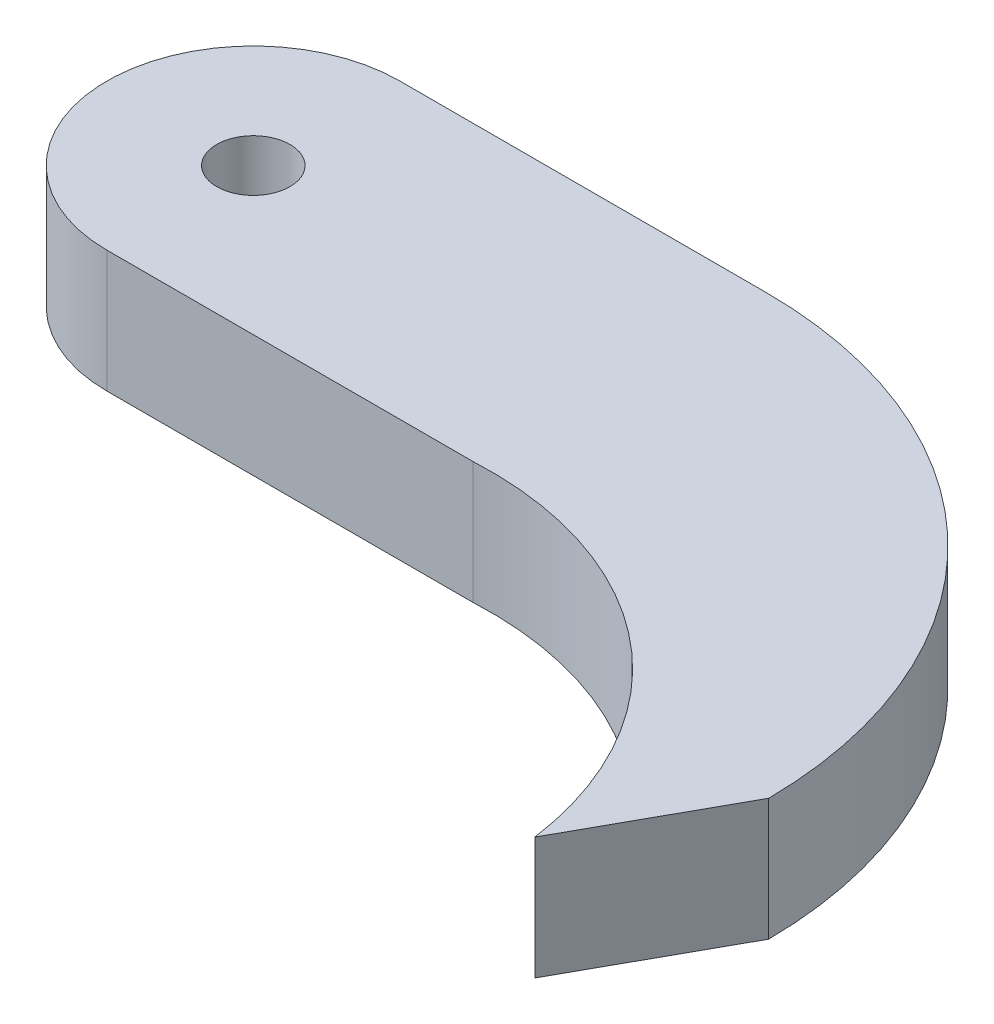
ISO-10303-21;
HEADER;
FILE_DESCRIPTION(('STEP AP214'),'2;1');
FILE_NAME('part.step','',(''),(''),'','','');
FILE_SCHEMA(('AUTOMOTIVE_DESIGN { 1 0 10303 214 1 1 1 1 }'));
ENDSEC;
DATA;
#1=APPLICATION_CONTEXT('core data for automotive mechanical design processes');
#2=APPLICATION_PROTOCOL_DEFINITION('international standard','automotive_design',2000,#1);
#3=PRODUCT_CONTEXT('',#1,'mechanical');
#4=PRODUCT('Part','Part','',(#3));
#5=PRODUCT_RELATED_PRODUCT_CATEGORY('part','',(#4));
#6=PRODUCT_DEFINITION_FORMATION('','',#4);
#7=PRODUCT_DEFINITION_CONTEXT('part definition',#1,'design');
#8=PRODUCT_DEFINITION('design','',#6,#7);
#9=PRODUCT_DEFINITION_SHAPE('','',#8);
#10=(LENGTH_UNIT() NAMED_UNIT(*) SI_UNIT(.MILLI.,.METRE.));
#11=(NAMED_UNIT(*) PLANE_ANGLE_UNIT() SI_UNIT($,.RADIAN.));
#12=(NAMED_UNIT(*) SI_UNIT($,.STERADIAN.) SOLID_ANGLE_UNIT());
#13=UNCERTAINTY_MEASURE_WITH_UNIT(LENGTH_MEASURE(1.E-05),#10,'distance_accuracy_value','');
#14=(GEOMETRIC_REPRESENTATION_CONTEXT(3) GLOBAL_UNCERTAINTY_ASSIGNED_CONTEXT((#13)) GLOBAL_UNIT_ASSIGNED_CONTEXT((#10,
#11,#12)) REPRESENTATION_CONTEXT('',''));
#15=CARTESIAN_POINT('',(0.,0.,0.));
#16=DIRECTION('',(0.,0.,1.));
#17=DIRECTION('',(1.,0.,0.));
#18=AXIS2_PLACEMENT_3D('',#15,#16,#17);
#19=CARTESIAN_POINT('',(0.,5.,0.));
#20=DIRECTION('',(0.,1.,0.));
#21=DIRECTION('',(0.,0.,1.));
#22=AXIS2_PLACEMENT_3D('',#19,#20,#21);
#23=PLANE('',#22);
#24=CARTESIAN_POINT('',(0.,5.,0.));
#25=DIRECTION('',(0.,1.,0.));
#26=DIRECTION('',(0.,0.,1.));
#27=AXIS2_PLACEMENT_3D('',#24,#25,#26);
#28=CIRCLE('',#27,6.);
#29=CARTESIAN_POINT('',(0.,5.,-6.));
#30=VERTEX_POINT('',#29);
#31=CARTESIAN_POINT('',(0.,5.,6.));
#32=VERTEX_POINT('',#31);
#33=EDGE_CURVE('E131',#30,#32,#28,.T.);
#34=ORIENTED_EDGE('',*,*,#33,.T.);
#35=DIRECTION('',(1.,0.,0.));
#36=VECTOR('',#35,1.);
#37=CARTESIAN_POINT('',(0.,5.,6.));
#38=LINE('',#37,#36);
#39=CARTESIAN_POINT('',(15.,5.,6.));
#40=VERTEX_POINT('',#39);
#41=EDGE_CURVE('E89',#32,#40,#38,.T.);
#42=ORIENTED_EDGE('',*,*,#41,.T.);
#43=CARTESIAN_POINT('',(15.7204658924848,5.,19.9814494562533));
#44=DIRECTION('',(0.,-1.,0.));
#45=DIRECTION('',(0.,0.,-1.));
#46=AXIS2_PLACEMENT_3D('',#43,#44,#45);
#47=CIRCLE('',#46,14.);
#48=CARTESIAN_POINT('',(29.5874188128625,5.,18.0559322000266));
#49=VERTEX_POINT('',#48);
#50=EDGE_CURVE('E102',#40,#49,#47,.T.);
#51=ORIENTED_EDGE('',*,*,#50,.T.);
#52=DIRECTION('',(0.484243634783495,0.,-0.874933198691003));
#53=VECTOR('',#52,1.);
#54=CARTESIAN_POINT('',(32.9996679542686,5.,11.8906677720164));
#55=LINE('',#54,#53);
#56=CARTESIAN_POINT('',(32.9996679542686,5.,11.8906677720164));
#57=VERTEX_POINT('',#56);
#58=EDGE_CURVE('E96',#49,#57,#55,.T.);
#59=ORIENTED_EDGE('',*,*,#58,.T.);
#60=CARTESIAN_POINT('',(15.,5.,12.));
#61=DIRECTION('',(0.,1.,0.));
#62=DIRECTION('',(0.,0.,-1.));
#63=AXIS2_PLACEMENT_3D('',#60,#61,#62);
#64=CIRCLE('',#63,18.);
#65=CARTESIAN_POINT('',(15.,5.,-6.));
#66=VERTEX_POINT('',#65);
#67=EDGE_CURVE('E100',#57,#66,#64,.T.);
#68=ORIENTED_EDGE('',*,*,#67,.T.);
#69=DIRECTION('',(-1.,0.,0.));
#70=VECTOR('',#69,1.);
#71=CARTESIAN_POINT('',(0.,5.,-6.));
#72=LINE('',#71,#70);
#73=EDGE_CURVE('E52',#66,#30,#72,.T.);
#74=ORIENTED_EDGE('',*,*,#73,.T.);
#75=EDGE_LOOP('',(#34,#42,#51,#59,#68,#74));
#76=FACE_BOUND('',#75,.T.);
#77=CARTESIAN_POINT('',(0.,5.,0.));
#78=DIRECTION('',(0.,1.,0.));
#79=DIRECTION('',(0.,0.,1.));
#80=AXIS2_PLACEMENT_3D('',#77,#78,#79);
#81=CIRCLE('',#80,1.5);
#82=CARTESIAN_POINT('',(0.,5.,1.5));
#83=VERTEX_POINT('',#82);
#84=EDGE_CURVE('E124',#83,#83,#81,.T.);
#85=ORIENTED_EDGE('',*,*,#84,.F.);
#86=EDGE_LOOP('',(#85));
#87=FACE_BOUND('',#86,.T.);
#88=ADVANCED_FACE('F35',(#76,#87),#23,.T.);
#89=CARTESIAN_POINT('',(0.,0.,0.));
#90=DIRECTION('',(0.,1.,0.));
#91=DIRECTION('',(0.,0.,1.));
#92=AXIS2_PLACEMENT_3D('',#89,#90,#91);
#93=PLANE('',#92);
#94=CARTESIAN_POINT('',(0.,0.,0.));
#95=DIRECTION('',(0.,1.,0.));
#96=DIRECTION('',(0.,0.,1.));
#97=AXIS2_PLACEMENT_3D('',#94,#95,#96);
#98=CIRCLE('',#97,6.);
#99=CARTESIAN_POINT('',(0.,0.,-6.));
#100=VERTEX_POINT('',#99);
#101=CARTESIAN_POINT('',(0.,0.,6.));
#102=VERTEX_POINT('',#101);
#103=EDGE_CURVE('E120',#100,#102,#98,.T.);
#104=ORIENTED_EDGE('',*,*,#103,.F.);
#105=DIRECTION('',(-1.,0.,0.));
#106=VECTOR('',#105,1.);
#107=CARTESIAN_POINT('',(0.,0.,-6.));
#108=LINE('',#107,#106);
#109=CARTESIAN_POINT('',(15.,0.,-6.));
#110=VERTEX_POINT('',#109);
#111=EDGE_CURVE('E81',#110,#100,#108,.T.);
#112=ORIENTED_EDGE('',*,*,#111,.F.);
#113=CARTESIAN_POINT('',(15.,0.,12.));
#114=DIRECTION('',(0.,1.,0.));
#115=DIRECTION('',(0.,0.,-1.));
#116=AXIS2_PLACEMENT_3D('',#113,#114,#115);
#117=CIRCLE('',#116,18.);
#118=CARTESIAN_POINT('',(32.9996679542686,0.,11.8906677720164));
#119=VERTEX_POINT('',#118);
#120=EDGE_CURVE('E75',#119,#110,#117,.T.);
#121=ORIENTED_EDGE('',*,*,#120,.F.);
#122=DIRECTION('',(0.484243634783495,0.,-0.874933198691003));
#123=VECTOR('',#122,1.);
#124=CARTESIAN_POINT('',(32.9996679542686,0.,11.8906677720164));
#125=LINE('',#124,#123);
#126=CARTESIAN_POINT('',(29.5874188128625,0.,18.0559322000266));
#127=VERTEX_POINT('',#126);
#128=EDGE_CURVE('E110',#127,#119,#125,.T.);
#129=ORIENTED_EDGE('',*,*,#128,.F.);
#130=CARTESIAN_POINT('',(15.7204658924848,0.,19.9814494562533));
#131=DIRECTION('',(0.,-1.,0.));
#132=DIRECTION('',(0.,0.,-1.));
#133=AXIS2_PLACEMENT_3D('',#130,#131,#132);
#134=CIRCLE('',#133,14.);
#135=CARTESIAN_POINT('',(15.,0.,6.));
#136=VERTEX_POINT('',#135);
#137=EDGE_CURVE('E126',#136,#127,#134,.T.);
#138=ORIENTED_EDGE('',*,*,#137,.F.);
#139=DIRECTION('',(1.,0.,0.));
#140=VECTOR('',#139,1.);
#141=CARTESIAN_POINT('',(0.,0.,6.));
#142=LINE('',#141,#140);
#143=EDGE_CURVE('E123',#102,#136,#142,.T.);
#144=ORIENTED_EDGE('',*,*,#143,.F.);
#145=EDGE_LOOP('',(#104,#112,#121,#129,#138,#144));
#146=FACE_BOUND('',#145,.T.);
#147=CARTESIAN_POINT('',(0.,0.,0.));
#148=DIRECTION('',(0.,1.,0.));
#149=DIRECTION('',(0.,0.,1.));
#150=AXIS2_PLACEMENT_3D('',#147,#148,#149);
#151=CIRCLE('',#150,1.5);
#152=CARTESIAN_POINT('',(0.,0.,1.5));
#153=VERTEX_POINT('',#152);
#154=EDGE_CURVE('E224',#153,#153,#151,.T.);
#155=ORIENTED_EDGE('',*,*,#154,.T.);
#156=EDGE_LOOP('',(#155));
#157=FACE_BOUND('',#156,.T.);
#158=ADVANCED_FACE('F140',(#146,#157),#93,.F.);
#159=CARTESIAN_POINT('',(0.,5.,0.));
#160=DIRECTION('',(0.,-1.,0.));
#161=DIRECTION('',(0.,0.,-1.));
#162=AXIS2_PLACEMENT_3D('',#159,#160,#161);
#163=CYLINDRICAL_SURFACE('',#162,6.);
#164=ORIENTED_EDGE('',*,*,#103,.T.);
#165=DIRECTION('',(0.,-1.,0.));
#166=VECTOR('',#165,1.);
#167=CARTESIAN_POINT('',(0.,5.,6.));
#168=LINE('',#167,#166);
#169=EDGE_CURVE('E11',#32,#102,#168,.T.);
#170=ORIENTED_EDGE('',*,*,#169,.F.);
#171=ORIENTED_EDGE('',*,*,#33,.F.);
#172=DIRECTION('',(0.,-1.,0.));
#173=VECTOR('',#172,1.);
#174=CARTESIAN_POINT('',(0.,5.,-6.));
#175=LINE('',#174,#173);
#176=EDGE_CURVE('E116',#30,#100,#175,.T.);
#177=ORIENTED_EDGE('',*,*,#176,.T.);
#178=EDGE_LOOP('',(#164,#170,#171,#177));
#179=FACE_BOUND('',#178,.T.);
#180=ADVANCED_FACE('F37',(#179),#163,.T.);
#181=CARTESIAN_POINT('',(0.,5.,6.));
#182=DIRECTION('',(0.,0.,-1.));
#183=DIRECTION('',(-1.,0.,0.));
#184=AXIS2_PLACEMENT_3D('',#181,#182,#183);
#185=PLANE('',#184);
#186=ORIENTED_EDGE('',*,*,#143,.T.);
#187=DIRECTION('',(0.,-1.,0.));
#188=VECTOR('',#187,1.);
#189=CARTESIAN_POINT('',(15.,5.,6.));
#190=LINE('',#189,#188);
#191=EDGE_CURVE('E44',#40,#136,#190,.T.);
#192=ORIENTED_EDGE('',*,*,#191,.F.);
#193=ORIENTED_EDGE('',*,*,#41,.F.);
#194=ORIENTED_EDGE('',*,*,#169,.T.);
#195=EDGE_LOOP('',(#186,#192,#193,#194));
#196=FACE_BOUND('',#195,.T.);
#197=ADVANCED_FACE('F165',(#196),#185,.F.);
#198=CARTESIAN_POINT('',(15.7204658924848,5.,19.9814494562533));
#199=DIRECTION('',(0.,-1.,0.));
#200=DIRECTION('',(0.,0.,-1.));
#201=AXIS2_PLACEMENT_3D('',#198,#199,#200);
#202=CYLINDRICAL_SURFACE('',#201,14.);
#203=ORIENTED_EDGE('',*,*,#137,.T.);
#204=DIRECTION('',(0.,-1.,0.));
#205=VECTOR('',#204,1.);
#206=CARTESIAN_POINT('',(29.5874188128625,5.,18.0559322000266));
#207=LINE('',#206,#205);
#208=EDGE_CURVE('E111',#49,#127,#207,.T.);
#209=ORIENTED_EDGE('',*,*,#208,.F.);
#210=ORIENTED_EDGE('',*,*,#50,.F.);
#211=ORIENTED_EDGE('',*,*,#191,.T.);
#212=EDGE_LOOP('',(#203,#209,#210,#211));
#213=FACE_BOUND('',#212,.T.);
#214=ADVANCED_FACE('F137',(#213),#202,.F.);
#215=CARTESIAN_POINT('',(32.9996679542686,5.,11.8906677720164));
#216=DIRECTION('',(-0.874933198691003,0.,-0.484243634783495));
#217=DIRECTION('',(-0.484243634783495,0.,0.874933198691003));
#218=AXIS2_PLACEMENT_3D('',#215,#216,#217);
#219=PLANE('',#218);
#220=ORIENTED_EDGE('',*,*,#128,.T.);
#221=DIRECTION('',(0.,-1.,0.));
#222=VECTOR('',#221,1.);
#223=CARTESIAN_POINT('',(32.9996679542686,5.,11.8906677720164));
#224=LINE('',#223,#222);
#225=EDGE_CURVE('E107',#57,#119,#224,.T.);
#226=ORIENTED_EDGE('',*,*,#225,.F.);
#227=ORIENTED_EDGE('',*,*,#58,.F.);
#228=ORIENTED_EDGE('',*,*,#208,.T.);
#229=EDGE_LOOP('',(#220,#226,#227,#228));
#230=FACE_BOUND('',#229,.T.);
#231=ADVANCED_FACE('F108',(#230),#219,.F.);
#232=CARTESIAN_POINT('',(15.,5.,12.));
#233=DIRECTION('',(0.,-1.,0.));
#234=DIRECTION('',(0.,0.,-1.));
#235=AXIS2_PLACEMENT_3D('',#232,#233,#234);
#236=CYLINDRICAL_SURFACE('',#235,18.);
#237=ORIENTED_EDGE('',*,*,#120,.T.);
#238=DIRECTION('',(0.,-1.,0.));
#239=VECTOR('',#238,1.);
#240=CARTESIAN_POINT('',(15.,5.,-6.));
#241=LINE('',#240,#239);
#242=EDGE_CURVE('E112',#66,#110,#241,.T.);
#243=ORIENTED_EDGE('',*,*,#242,.F.);
#244=ORIENTED_EDGE('',*,*,#67,.F.);
#245=ORIENTED_EDGE('',*,*,#225,.T.);
#246=EDGE_LOOP('',(#237,#243,#244,#245));
#247=FACE_BOUND('',#246,.T.);
#248=ADVANCED_FACE('F114',(#247),#236,.T.);
#249=CARTESIAN_POINT('',(0.,5.,-6.));
#250=DIRECTION('',(0.,0.,1.));
#251=DIRECTION('',(1.,0.,0.));
#252=AXIS2_PLACEMENT_3D('',#249,#250,#251);
#253=PLANE('',#252);
#254=ORIENTED_EDGE('',*,*,#111,.T.);
#255=ORIENTED_EDGE('',*,*,#176,.F.);
#256=ORIENTED_EDGE('',*,*,#73,.F.);
#257=ORIENTED_EDGE('',*,*,#242,.T.);
#258=EDGE_LOOP('',(#254,#255,#256,#257));
#259=FACE_BOUND('',#258,.T.);
#260=ADVANCED_FACE('F145',(#259),#253,.F.);
#261=CARTESIAN_POINT('',(0.,5.,0.));
#262=DIRECTION('',(0.,-1.,0.));
#263=DIRECTION('',(0.,0.,-1.));
#264=AXIS2_PLACEMENT_3D('',#261,#262,#263);
#265=CYLINDRICAL_SURFACE('',#264,1.5);
#266=ORIENTED_EDGE('',*,*,#84,.T.);
#267=EDGE_LOOP('',(#266));
#268=FACE_BOUND('',#267,.T.);
#269=ORIENTED_EDGE('',*,*,#154,.F.);
#270=EDGE_LOOP('',(#269));
#271=FACE_BOUND('',#270,.T.);
#272=ADVANCED_FACE('F147',(#268,#271),#265,.F.);
#273=CLOSED_SHELL('',(#88,#158,#180,#197,#214,#231,#248,#260,#272));
#274=MANIFOLD_SOLID_BREP('B2',#273);
#275=ADVANCED_BREP_SHAPE_REPRESENTATION('',(#18,#274),#14);
#276=SHAPE_DEFINITION_REPRESENTATION(#9,#275);
ENDSEC;
END-ISO-10303-21;
